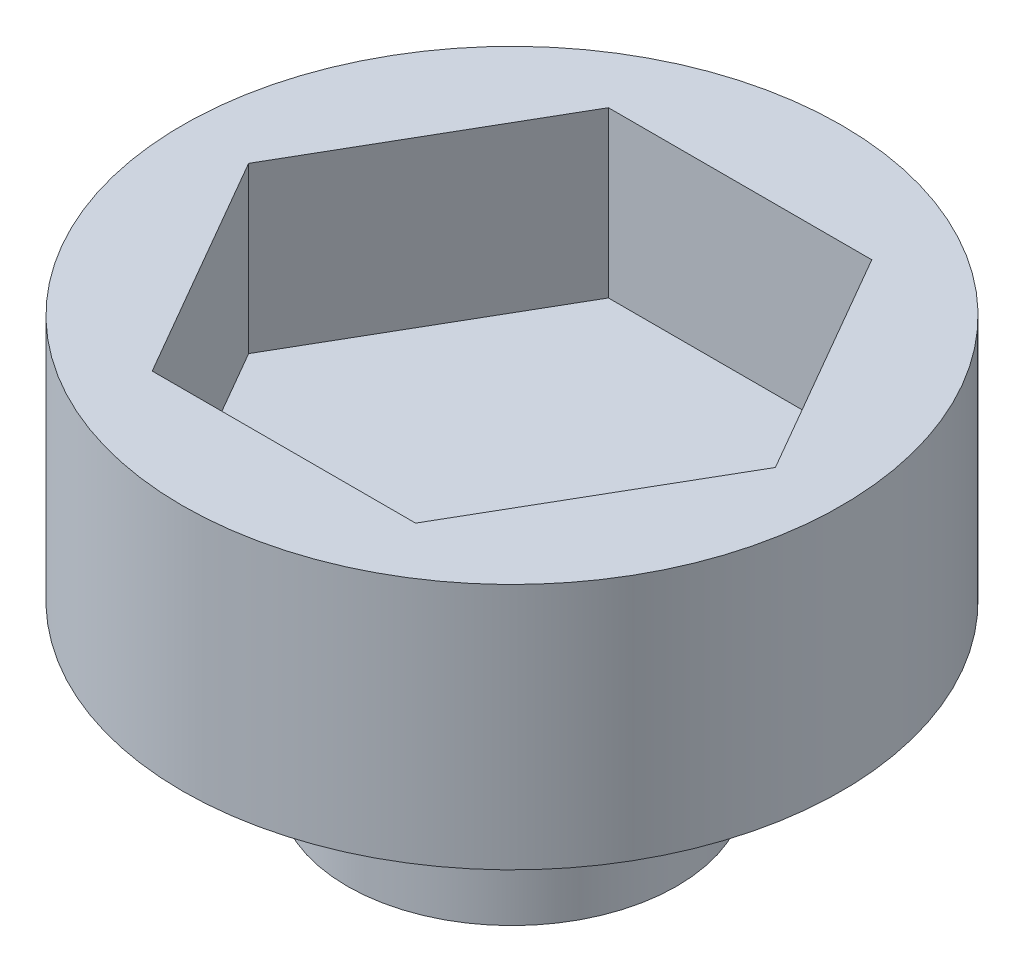
ISO-10303-21;
HEADER;
FILE_DESCRIPTION(('STEP AP214'),'2;1');
FILE_NAME('part.step','',(''),(''),'','','');
FILE_SCHEMA(('AUTOMOTIVE_DESIGN { 1 0 10303 214 1 1 1 1 }'));
ENDSEC;
DATA;
#1=APPLICATION_CONTEXT('core data for automotive mechanical design processes');
#2=APPLICATION_PROTOCOL_DEFINITION('international standard','automotive_design',2000,#1);
#3=PRODUCT_CONTEXT('',#1,'mechanical');
#4=PRODUCT('Part','Part','',(#3));
#5=PRODUCT_RELATED_PRODUCT_CATEGORY('part','',(#4));
#6=PRODUCT_DEFINITION_FORMATION('','',#4);
#7=PRODUCT_DEFINITION_CONTEXT('part definition',#1,'design');
#8=PRODUCT_DEFINITION('design','',#6,#7);
#9=PRODUCT_DEFINITION_SHAPE('','',#8);
#10=(LENGTH_UNIT() NAMED_UNIT(*) SI_UNIT(.MILLI.,.METRE.));
#11=(NAMED_UNIT(*) PLANE_ANGLE_UNIT() SI_UNIT($,.RADIAN.));
#12=(NAMED_UNIT(*) SI_UNIT($,.STERADIAN.) SOLID_ANGLE_UNIT());
#13=UNCERTAINTY_MEASURE_WITH_UNIT(LENGTH_MEASURE(1.E-05),#10,'distance_accuracy_value','');
#14=(GEOMETRIC_REPRESENTATION_CONTEXT(3) GLOBAL_UNCERTAINTY_ASSIGNED_CONTEXT((#13)) GLOBAL_UNIT_ASSIGNED_CONTEXT((#10,
#11,#12)) REPRESENTATION_CONTEXT('',''));
#15=CARTESIAN_POINT('',(0.,0.,0.));
#16=DIRECTION('',(0.,0.,1.));
#17=DIRECTION('',(1.,0.,0.));
#18=AXIS2_PLACEMENT_3D('',#15,#16,#17);
#19=CARTESIAN_POINT('',(0.,2.,0.));
#20=DIRECTION('',(0.,-1.,0.));
#21=DIRECTION('',(0.,0.,-1.));
#22=AXIS2_PLACEMENT_3D('',#19,#20,#21);
#23=CYLINDRICAL_SURFACE('',#22,2.);
#24=CARTESIAN_POINT('',(0.,2.,0.));
#25=DIRECTION('',(0.,1.,0.));
#26=DIRECTION('',(0.,0.,1.));
#27=AXIS2_PLACEMENT_3D('',#24,#25,#26);
#28=CIRCLE('',#27,2.);
#29=CARTESIAN_POINT('',(0.,2.,2.));
#30=VERTEX_POINT('',#29);
#31=EDGE_CURVE('E11',#30,#30,#28,.T.);
#32=ORIENTED_EDGE('',*,*,#31,.F.);
#33=EDGE_LOOP('',(#32));
#34=FACE_BOUND('',#33,.T.);
#35=CARTESIAN_POINT('',(0.,0.,0.));
#36=DIRECTION('',(0.,1.,0.));
#37=DIRECTION('',(0.,0.,1.));
#38=AXIS2_PLACEMENT_3D('',#35,#36,#37);
#39=CIRCLE('',#38,2.);
#40=CARTESIAN_POINT('',(0.,0.,2.));
#41=VERTEX_POINT('',#40);
#42=EDGE_CURVE('E42',#41,#41,#39,.T.);
#43=ORIENTED_EDGE('',*,*,#42,.T.);
#44=EDGE_LOOP('',(#43));
#45=FACE_BOUND('',#44,.T.);
#46=ADVANCED_FACE('F39',(#34,#45),#23,.T.);
#47=CARTESIAN_POINT('',(0.,0.,0.));
#48=DIRECTION('',(0.,1.,0.));
#49=DIRECTION('',(0.,0.,1.));
#50=AXIS2_PLACEMENT_3D('',#47,#48,#49);
#51=PLANE('',#50);
#52=ORIENTED_EDGE('',*,*,#42,.F.);
#53=EDGE_LOOP('',(#52));
#54=FACE_BOUND('',#53,.T.);
#55=ADVANCED_FACE('F189',(#54),#51,.F.);
#56=CARTESIAN_POINT('',(0.,5.,0.));
#57=DIRECTION('',(0.,-1.,0.));
#58=DIRECTION('',(0.,0.,-1.));
#59=AXIS2_PLACEMENT_3D('',#56,#57,#58);
#60=CYLINDRICAL_SURFACE('',#59,4.);
#61=CARTESIAN_POINT('',(0.,5.,0.));
#62=DIRECTION('',(0.,1.,0.));
#63=DIRECTION('',(0.,0.,1.));
#64=AXIS2_PLACEMENT_3D('',#61,#62,#63);
#65=CIRCLE('',#64,4.);
#66=CARTESIAN_POINT('',(0.,5.,4.));
#67=VERTEX_POINT('',#66);
#68=EDGE_CURVE('E163',#67,#67,#65,.T.);
#69=ORIENTED_EDGE('',*,*,#68,.F.);
#70=EDGE_LOOP('',(#69));
#71=FACE_BOUND('',#70,.T.);
#72=CARTESIAN_POINT('',(0.,2.,0.));
#73=DIRECTION('',(0.,1.,0.));
#74=DIRECTION('',(0.,0.,1.));
#75=AXIS2_PLACEMENT_3D('',#72,#73,#74);
#76=CIRCLE('',#75,4.);
#77=CARTESIAN_POINT('',(0.,2.,4.));
#78=VERTEX_POINT('',#77);
#79=EDGE_CURVE('E153',#78,#78,#76,.T.);
#80=ORIENTED_EDGE('',*,*,#79,.T.);
#81=EDGE_LOOP('',(#80));
#82=FACE_BOUND('',#81,.T.);
#83=ADVANCED_FACE('F171',(#71,#82),#60,.T.);
#84=CARTESIAN_POINT('',(0.,5.,0.));
#85=DIRECTION('',(0.,1.,0.));
#86=DIRECTION('',(0.,0.,1.));
#87=AXIS2_PLACEMENT_3D('',#84,#85,#86);
#88=PLANE('',#87);
#89=DIRECTION('',(0.499999999999995,0.,-0.866025403784442));
#90=VECTOR('',#89,1.);
#91=CARTESIAN_POINT('',(1.59833577481885,5.,2.76839876954114));
#92=LINE('',#91,#90);
#93=CARTESIAN_POINT('',(1.59833577481885,5.,2.76839876954114));
#94=VERTEX_POINT('',#93);
#95=CARTESIAN_POINT('',(3.19667154963763,5.,0.));
#96=VERTEX_POINT('',#95);
#97=EDGE_CURVE('E54',#94,#96,#92,.T.);
#98=ORIENTED_EDGE('',*,*,#97,.F.);
#99=DIRECTION('',(1.,0.,0.));
#100=VECTOR('',#99,1.);
#101=CARTESIAN_POINT('',(-1.59833577481879,5.,2.76839876954117));
#102=LINE('',#101,#100);
#103=CARTESIAN_POINT('',(-1.59833577481879,5.,2.76839876954117));
#104=VERTEX_POINT('',#103);
#105=EDGE_CURVE('E147',#104,#94,#102,.T.);
#106=ORIENTED_EDGE('',*,*,#105,.F.);
#107=DIRECTION('',(0.500000000000007,0.,0.866025403784435));
#108=VECTOR('',#107,1.);
#109=CARTESIAN_POINT('',(-3.19667154963763,5.,0.));
#110=LINE('',#109,#108);
#111=CARTESIAN_POINT('',(-3.19667154963763,5.,0.));
#112=VERTEX_POINT('',#111);
#113=EDGE_CURVE('E144',#112,#104,#110,.T.);
#114=ORIENTED_EDGE('',*,*,#113,.F.);
#115=DIRECTION('',(-0.499999999999995,0.,0.866025403784442));
#116=VECTOR('',#115,1.);
#117=CARTESIAN_POINT('',(-1.59833577481883,5.,-2.76839876954115));
#118=LINE('',#117,#116);
#119=CARTESIAN_POINT('',(-1.59833577481883,5.,-2.76839876954115));
#120=VERTEX_POINT('',#119);
#121=EDGE_CURVE('E102',#120,#112,#118,.T.);
#122=ORIENTED_EDGE('',*,*,#121,.F.);
#123=DIRECTION('',(-1.,0.,0.));
#124=VECTOR('',#123,1.);
#125=CARTESIAN_POINT('',(1.59833577481881,5.,-2.76839876954116));
#126=LINE('',#125,#124);
#127=CARTESIAN_POINT('',(1.59833577481881,5.,-2.76839876954116));
#128=VERTEX_POINT('',#127);
#129=EDGE_CURVE('E138',#128,#120,#126,.T.);
#130=ORIENTED_EDGE('',*,*,#129,.F.);
#131=DIRECTION('',(-0.500000000000001,0.,-0.866025403784438));
#132=VECTOR('',#131,1.);
#133=CARTESIAN_POINT('',(3.19667154963763,5.,0.));
#134=LINE('',#133,#132);
#135=EDGE_CURVE('E134',#96,#128,#134,.T.);
#136=ORIENTED_EDGE('',*,*,#135,.F.);
#137=EDGE_LOOP('',(#98,#106,#114,#122,#130,#136));
#138=FACE_BOUND('',#137,.T.);
#139=ORIENTED_EDGE('',*,*,#68,.T.);
#140=EDGE_LOOP('',(#139));
#141=FACE_BOUND('',#140,.T.);
#142=ADVANCED_FACE('F176',(#138,#141),#88,.T.);
#143=CARTESIAN_POINT('',(0.,2.,0.));
#144=DIRECTION('',(0.,1.,0.));
#145=DIRECTION('',(0.,0.,1.));
#146=AXIS2_PLACEMENT_3D('',#143,#144,#145);
#147=PLANE('',#146);
#148=ORIENTED_EDGE('',*,*,#31,.T.);
#149=EDGE_LOOP('',(#148));
#150=FACE_BOUND('',#149,.T.);
#151=ORIENTED_EDGE('',*,*,#79,.F.);
#152=EDGE_LOOP('',(#151));
#153=FACE_BOUND('',#152,.T.);
#154=ADVANCED_FACE('F173',(#150,#153),#147,.F.);
#155=CARTESIAN_POINT('',(1.59833577481885,3.,2.76839876954114));
#156=DIRECTION('',(0.866025403784442,0.,0.499999999999995));
#157=DIRECTION('',(0.499999999999995,0.,-0.866025403784442));
#158=AXIS2_PLACEMENT_3D('',#155,#156,#157);
#159=PLANE('',#158);
#160=ORIENTED_EDGE('',*,*,#97,.T.);
#161=DIRECTION('',(0.,1.,0.));
#162=VECTOR('',#161,1.);
#163=CARTESIAN_POINT('',(3.19667154963763,3.,0.));
#164=LINE('',#163,#162);
#165=CARTESIAN_POINT('',(3.19667154963763,3.,0.));
#166=VERTEX_POINT('',#165);
#167=EDGE_CURVE('E84',#166,#96,#164,.T.);
#168=ORIENTED_EDGE('',*,*,#167,.F.);
#169=DIRECTION('',(0.499999999999995,0.,-0.866025403784442));
#170=VECTOR('',#169,1.);
#171=CARTESIAN_POINT('',(1.59833577481885,3.,2.76839876954114));
#172=LINE('',#171,#170);
#173=CARTESIAN_POINT('',(1.59833577481885,3.,2.76839876954114));
#174=VERTEX_POINT('',#173);
#175=EDGE_CURVE('E150',#174,#166,#172,.T.);
#176=ORIENTED_EDGE('',*,*,#175,.F.);
#177=DIRECTION('',(0.,1.,0.));
#178=VECTOR('',#177,1.);
#179=CARTESIAN_POINT('',(1.59833577481885,3.,2.76839876954114));
#180=LINE('',#179,#178);
#181=EDGE_CURVE('E62',#174,#94,#180,.T.);
#182=ORIENTED_EDGE('',*,*,#181,.T.);
#183=EDGE_LOOP('',(#160,#168,#176,#182));
#184=FACE_BOUND('',#183,.T.);
#185=ADVANCED_FACE('F175',(#184),#159,.F.);
#186=CARTESIAN_POINT('',(-1.59833577481879,3.,2.76839876954117));
#187=DIRECTION('',(0.,0.,1.));
#188=DIRECTION('',(1.,0.,0.));
#189=AXIS2_PLACEMENT_3D('',#186,#187,#188);
#190=PLANE('',#189);
#191=ORIENTED_EDGE('',*,*,#105,.T.);
#192=ORIENTED_EDGE('',*,*,#181,.F.);
#193=DIRECTION('',(1.,0.,0.));
#194=VECTOR('',#193,1.);
#195=CARTESIAN_POINT('',(-1.59833577481879,3.,2.76839876954117));
#196=LINE('',#195,#194);
#197=CARTESIAN_POINT('',(-1.59833577481879,3.,2.76839876954117));
#198=VERTEX_POINT('',#197);
#199=EDGE_CURVE('E116',#198,#174,#196,.T.);
#200=ORIENTED_EDGE('',*,*,#199,.F.);
#201=DIRECTION('',(0.,1.,0.));
#202=VECTOR('',#201,1.);
#203=CARTESIAN_POINT('',(-1.59833577481879,3.,2.76839876954117));
#204=LINE('',#203,#202);
#205=EDGE_CURVE('E107',#198,#104,#204,.T.);
#206=ORIENTED_EDGE('',*,*,#205,.T.);
#207=EDGE_LOOP('',(#191,#192,#200,#206));
#208=FACE_BOUND('',#207,.T.);
#209=ADVANCED_FACE('F183',(#208),#190,.F.);
#210=CARTESIAN_POINT('',(-3.19667154963763,3.,0.));
#211=DIRECTION('',(-0.866025403784435,0.,0.500000000000007));
#212=DIRECTION('',(0.500000000000007,0.,0.866025403784434));
#213=AXIS2_PLACEMENT_3D('',#210,#211,#212);
#214=PLANE('',#213);
#215=ORIENTED_EDGE('',*,*,#113,.T.);
#216=ORIENTED_EDGE('',*,*,#205,.F.);
#217=DIRECTION('',(0.500000000000007,0.,0.866025403784435));
#218=VECTOR('',#217,1.);
#219=CARTESIAN_POINT('',(-3.19667154963763,3.,0.));
#220=LINE('',#219,#218);
#221=CARTESIAN_POINT('',(-3.19667154963763,3.,0.));
#222=VERTEX_POINT('',#221);
#223=EDGE_CURVE('E111',#222,#198,#220,.T.);
#224=ORIENTED_EDGE('',*,*,#223,.F.);
#225=DIRECTION('',(0.,1.,0.));
#226=VECTOR('',#225,1.);
#227=CARTESIAN_POINT('',(-3.19667154963763,3.,0.));
#228=LINE('',#227,#226);
#229=EDGE_CURVE('E95',#222,#112,#228,.T.);
#230=ORIENTED_EDGE('',*,*,#229,.T.);
#231=EDGE_LOOP('',(#215,#216,#224,#230));
#232=FACE_BOUND('',#231,.T.);
#233=ADVANCED_FACE('F112',(#232),#214,.F.);
#234=CARTESIAN_POINT('',(-1.59833577481883,3.,-2.76839876954115));
#235=DIRECTION('',(-0.866025403784442,0.,-0.499999999999995));
#236=DIRECTION('',(-0.499999999999995,0.,0.866025403784442));
#237=AXIS2_PLACEMENT_3D('',#234,#235,#236);
#238=PLANE('',#237);
#239=ORIENTED_EDGE('',*,*,#121,.T.);
#240=ORIENTED_EDGE('',*,*,#229,.F.);
#241=DIRECTION('',(-0.499999999999995,0.,0.866025403784442));
#242=VECTOR('',#241,1.);
#243=CARTESIAN_POINT('',(-1.59833577481883,3.,-2.76839876954115));
#244=LINE('',#243,#242);
#245=CARTESIAN_POINT('',(-1.59833577481883,3.,-2.76839876954115));
#246=VERTEX_POINT('',#245);
#247=EDGE_CURVE('E99',#246,#222,#244,.T.);
#248=ORIENTED_EDGE('',*,*,#247,.F.);
#249=DIRECTION('',(0.,1.,0.));
#250=VECTOR('',#249,1.);
#251=CARTESIAN_POINT('',(-1.59833577481883,3.,-2.76839876954115));
#252=LINE('',#251,#250);
#253=EDGE_CURVE('E108',#246,#120,#252,.T.);
#254=ORIENTED_EDGE('',*,*,#253,.T.);
#255=EDGE_LOOP('',(#239,#240,#248,#254));
#256=FACE_BOUND('',#255,.T.);
#257=ADVANCED_FACE('F97',(#256),#238,.F.);
#258=CARTESIAN_POINT('',(1.59833577481881,3.,-2.76839876954116));
#259=DIRECTION('',(0.,0.,-1.));
#260=DIRECTION('',(-1.,0.,0.));
#261=AXIS2_PLACEMENT_3D('',#258,#259,#260);
#262=PLANE('',#261);
#263=ORIENTED_EDGE('',*,*,#129,.T.);
#264=ORIENTED_EDGE('',*,*,#253,.F.);
#265=DIRECTION('',(-1.,0.,0.));
#266=VECTOR('',#265,1.);
#267=CARTESIAN_POINT('',(1.59833577481881,3.,-2.76839876954116));
#268=LINE('',#267,#266);
#269=CARTESIAN_POINT('',(1.59833577481881,3.,-2.76839876954116));
#270=VERTEX_POINT('',#269);
#271=EDGE_CURVE('E122',#270,#246,#268,.T.);
#272=ORIENTED_EDGE('',*,*,#271,.F.);
#273=DIRECTION('',(0.,1.,0.));
#274=VECTOR('',#273,1.);
#275=CARTESIAN_POINT('',(1.59833577481881,3.,-2.76839876954116));
#276=LINE('',#275,#274);
#277=EDGE_CURVE('E158',#270,#128,#276,.T.);
#278=ORIENTED_EDGE('',*,*,#277,.T.);
#279=EDGE_LOOP('',(#263,#264,#272,#278));
#280=FACE_BOUND('',#279,.T.);
#281=ADVANCED_FACE('F245',(#280),#262,.F.);
#282=CARTESIAN_POINT('',(3.19667154963763,3.,0.));
#283=DIRECTION('',(0.866025403784438,0.,-0.500000000000001));
#284=DIRECTION('',(-0.500000000000001,0.,-0.866025403784438));
#285=AXIS2_PLACEMENT_3D('',#282,#283,#284);
#286=PLANE('',#285);
#287=ORIENTED_EDGE('',*,*,#135,.T.);
#288=ORIENTED_EDGE('',*,*,#277,.F.);
#289=DIRECTION('',(-0.500000000000001,0.,-0.866025403784438));
#290=VECTOR('',#289,1.);
#291=CARTESIAN_POINT('',(3.19667154963763,3.,0.));
#292=LINE('',#291,#290);
#293=EDGE_CURVE('E126',#166,#270,#292,.T.);
#294=ORIENTED_EDGE('',*,*,#293,.F.);
#295=ORIENTED_EDGE('',*,*,#167,.T.);
#296=EDGE_LOOP('',(#287,#288,#294,#295));
#297=FACE_BOUND('',#296,.T.);
#298=ADVANCED_FACE('F254',(#297),#286,.F.);
#299=CARTESIAN_POINT('',(0.,3.,0.));
#300=DIRECTION('',(0.,1.,0.));
#301=DIRECTION('',(0.,0.,1.));
#302=AXIS2_PLACEMENT_3D('',#299,#300,#301);
#303=PLANE('',#302);
#304=ORIENTED_EDGE('',*,*,#175,.T.);
#305=ORIENTED_EDGE('',*,*,#293,.T.);
#306=ORIENTED_EDGE('',*,*,#271,.T.);
#307=ORIENTED_EDGE('',*,*,#247,.T.);
#308=ORIENTED_EDGE('',*,*,#223,.T.);
#309=ORIENTED_EDGE('',*,*,#199,.T.);
#310=EDGE_LOOP('',(#304,#305,#306,#307,#308,#309));
#311=FACE_BOUND('',#310,.T.);
#312=ADVANCED_FACE('F119',(#311),#303,.T.);
#313=CLOSED_SHELL('',(#46,#55,#83,#142,#154,#185,#209,#233,#257,#281,#298,#312));
#314=MANIFOLD_SOLID_BREP('B2',#313);
#315=ADVANCED_BREP_SHAPE_REPRESENTATION('',(#18,#314),#14);
#316=SHAPE_DEFINITION_REPRESENTATION(#9,#315);
ENDSEC;
END-ISO-10303-21;
